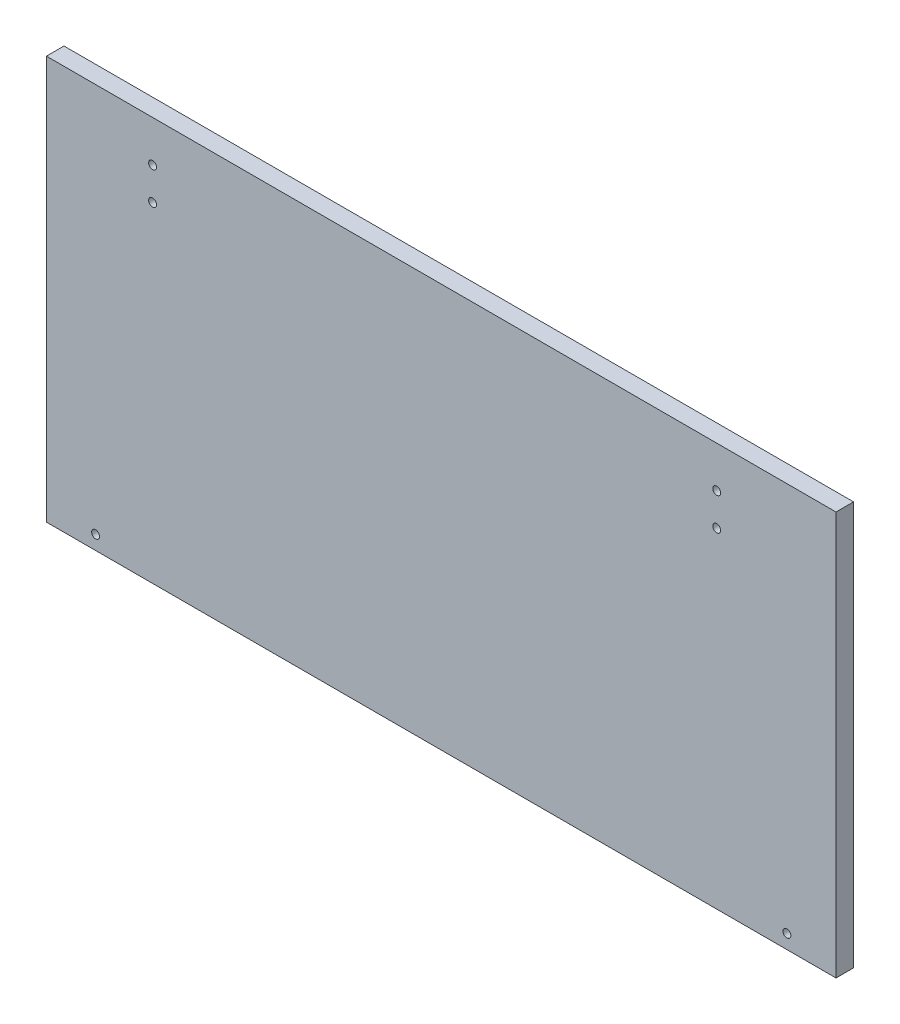
ISO-10303-21;
HEADER;
FILE_DESCRIPTION(('STEP AP214'),'2;1');
FILE_NAME('part.step','',(''),(''),'','','');
FILE_SCHEMA(('AUTOMOTIVE_DESIGN { 1 0 10303 214 1 1 1 1 }'));
ENDSEC;
DATA;
#1=APPLICATION_CONTEXT('core data for automotive mechanical design processes');
#2=APPLICATION_PROTOCOL_DEFINITION('international standard','automotive_design',2000,#1);
#3=PRODUCT_CONTEXT('',#1,'mechanical');
#4=PRODUCT('Part','Part','',(#3));
#5=PRODUCT_RELATED_PRODUCT_CATEGORY('part','',(#4));
#6=PRODUCT_DEFINITION_FORMATION('','',#4);
#7=PRODUCT_DEFINITION_CONTEXT('part definition',#1,'design');
#8=PRODUCT_DEFINITION('design','',#6,#7);
#9=PRODUCT_DEFINITION_SHAPE('','',#8);
#10=(LENGTH_UNIT() NAMED_UNIT(*) SI_UNIT(.MILLI.,.METRE.));
#11=(NAMED_UNIT(*) PLANE_ANGLE_UNIT() SI_UNIT($,.RADIAN.));
#12=(NAMED_UNIT(*) SI_UNIT($,.STERADIAN.) SOLID_ANGLE_UNIT());
#13=UNCERTAINTY_MEASURE_WITH_UNIT(LENGTH_MEASURE(1.E-05),#10,'distance_accuracy_value','');
#14=(GEOMETRIC_REPRESENTATION_CONTEXT(3) GLOBAL_UNCERTAINTY_ASSIGNED_CONTEXT((#13)) GLOBAL_UNIT_ASSIGNED_CONTEXT((#10,
#11,#12)) REPRESENTATION_CONTEXT('',''));
#15=CARTESIAN_POINT('',(0.,0.,0.));
#16=DIRECTION('',(0.,0.,1.));
#17=DIRECTION('',(1.,0.,0.));
#18=AXIS2_PLACEMENT_3D('',#15,#16,#17);
#19=CARTESIAN_POINT('',(-225.,115.,10.));
#20=DIRECTION('',(1.,0.,0.));
#21=DIRECTION('',(0.,1.,0.));
#22=AXIS2_PLACEMENT_3D('',#19,#20,#21);
#23=PLANE('',#22);
#24=DIRECTION('',(0.,-1.,0.));
#25=VECTOR('',#24,1.);
#26=CARTESIAN_POINT('',(-225.,115.,0.));
#27=LINE('',#26,#25);
#28=CARTESIAN_POINT('',(-225.,115.,0.));
#29=VERTEX_POINT('',#28);
#30=CARTESIAN_POINT('',(-225.,-115.,0.));
#31=VERTEX_POINT('',#30);
#32=EDGE_CURVE('E100',#29,#31,#27,.T.);
#33=ORIENTED_EDGE('',*,*,#32,.T.);
#34=DIRECTION('',(0.,0.,-1.));
#35=VECTOR('',#34,1.);
#36=CARTESIAN_POINT('',(-225.,-115.,10.));
#37=LINE('',#36,#35);
#38=CARTESIAN_POINT('',(-225.,-115.,10.));
#39=VERTEX_POINT('',#38);
#40=EDGE_CURVE('E11',#39,#31,#37,.T.);
#41=ORIENTED_EDGE('',*,*,#40,.F.);
#42=DIRECTION('',(0.,-1.,0.));
#43=VECTOR('',#42,1.);
#44=CARTESIAN_POINT('',(-225.,115.,10.));
#45=LINE('',#44,#43);
#46=CARTESIAN_POINT('',(-225.,115.,10.));
#47=VERTEX_POINT('',#46);
#48=EDGE_CURVE('E88',#47,#39,#45,.T.);
#49=ORIENTED_EDGE('',*,*,#48,.F.);
#50=DIRECTION('',(0.,0.,-1.));
#51=VECTOR('',#50,1.);
#52=CARTESIAN_POINT('',(-225.,115.,10.));
#53=LINE('',#52,#51);
#54=EDGE_CURVE('E96',#47,#29,#53,.T.);
#55=ORIENTED_EDGE('',*,*,#54,.T.);
#56=EDGE_LOOP('',(#33,#41,#49,#55));
#57=FACE_BOUND('',#56,.T.);
#58=ADVANCED_FACE('F37',(#57),#23,.F.);
#59=CARTESIAN_POINT('',(-225.,-115.,10.));
#60=DIRECTION('',(0.,1.,0.));
#61=DIRECTION('',(0.,0.,1.));
#62=AXIS2_PLACEMENT_3D('',#59,#60,#61);
#63=PLANE('',#62);
#64=DIRECTION('',(1.,0.,0.));
#65=VECTOR('',#64,1.);
#66=CARTESIAN_POINT('',(-225.,-115.,0.));
#67=LINE('',#66,#65);
#68=CARTESIAN_POINT('',(225.,-115.,0.));
#69=VERTEX_POINT('',#68);
#70=EDGE_CURVE('E92',#31,#69,#67,.T.);
#71=ORIENTED_EDGE('',*,*,#70,.T.);
#72=DIRECTION('',(0.,0.,-1.));
#73=VECTOR('',#72,1.);
#74=CARTESIAN_POINT('',(225.,-115.,10.));
#75=LINE('',#74,#73);
#76=CARTESIAN_POINT('',(225.,-115.,10.));
#77=VERTEX_POINT('',#76);
#78=EDGE_CURVE('E45',#77,#69,#75,.T.);
#79=ORIENTED_EDGE('',*,*,#78,.F.);
#80=DIRECTION('',(1.,0.,0.));
#81=VECTOR('',#80,1.);
#82=CARTESIAN_POINT('',(-225.,-115.,10.));
#83=LINE('',#82,#81);
#84=EDGE_CURVE('E83',#39,#77,#83,.T.);
#85=ORIENTED_EDGE('',*,*,#84,.F.);
#86=ORIENTED_EDGE('',*,*,#40,.T.);
#87=EDGE_LOOP('',(#71,#79,#85,#86));
#88=FACE_BOUND('',#87,.T.);
#89=ADVANCED_FACE('F91',(#88),#63,.F.);
#90=CARTESIAN_POINT('',(225.,115.,10.));
#91=DIRECTION('',(-1.,0.,0.));
#92=DIRECTION('',(0.,-1.,0.));
#93=AXIS2_PLACEMENT_3D('',#90,#91,#92);
#94=PLANE('',#93);
#95=DIRECTION('',(0.,1.,0.));
#96=VECTOR('',#95,1.);
#97=CARTESIAN_POINT('',(225.,115.,0.));
#98=LINE('',#97,#96);
#99=CARTESIAN_POINT('',(225.,115.,0.));
#100=VERTEX_POINT('',#99);
#101=EDGE_CURVE('E70',#69,#100,#98,.T.);
#102=ORIENTED_EDGE('',*,*,#101,.T.);
#103=DIRECTION('',(0.,0.,-1.));
#104=VECTOR('',#103,1.);
#105=CARTESIAN_POINT('',(225.,115.,10.));
#106=LINE('',#105,#104);
#107=CARTESIAN_POINT('',(225.,115.,10.));
#108=VERTEX_POINT('',#107);
#109=EDGE_CURVE('E93',#108,#100,#106,.T.);
#110=ORIENTED_EDGE('',*,*,#109,.F.);
#111=DIRECTION('',(0.,1.,0.));
#112=VECTOR('',#111,1.);
#113=CARTESIAN_POINT('',(225.,115.,10.));
#114=LINE('',#113,#112);
#115=EDGE_CURVE('E86',#77,#108,#114,.T.);
#116=ORIENTED_EDGE('',*,*,#115,.F.);
#117=ORIENTED_EDGE('',*,*,#78,.T.);
#118=EDGE_LOOP('',(#102,#110,#116,#117));
#119=FACE_BOUND('',#118,.T.);
#120=ADVANCED_FACE('F94',(#119),#94,.F.);
#121=CARTESIAN_POINT('',(-225.,115.,10.));
#122=DIRECTION('',(0.,-1.,0.));
#123=DIRECTION('',(0.,0.,-1.));
#124=AXIS2_PLACEMENT_3D('',#121,#122,#123);
#125=PLANE('',#124);
#126=DIRECTION('',(-1.,0.,0.));
#127=VECTOR('',#126,1.);
#128=CARTESIAN_POINT('',(-225.,115.,0.));
#129=LINE('',#128,#127);
#130=EDGE_CURVE('E76',#100,#29,#129,.T.);
#131=ORIENTED_EDGE('',*,*,#130,.T.);
#132=ORIENTED_EDGE('',*,*,#54,.F.);
#133=DIRECTION('',(-1.,0.,0.));
#134=VECTOR('',#133,1.);
#135=CARTESIAN_POINT('',(-225.,115.,10.));
#136=LINE('',#135,#134);
#137=EDGE_CURVE('E53',#108,#47,#136,.T.);
#138=ORIENTED_EDGE('',*,*,#137,.F.);
#139=ORIENTED_EDGE('',*,*,#109,.T.);
#140=EDGE_LOOP('',(#131,#132,#138,#139));
#141=FACE_BOUND('',#140,.T.);
#142=ADVANCED_FACE('F108',(#141),#125,.F.);
#143=CARTESIAN_POINT('',(0.,0.,10.));
#144=DIRECTION('',(0.,0.,1.));
#145=DIRECTION('',(1.,0.,0.));
#146=AXIS2_PLACEMENT_3D('',#143,#144,#145);
#147=PLANE('',#146);
#148=CARTESIAN_POINT('',(-197.,-107.,10.));
#149=DIRECTION('',(0.,0.,1.));
#150=DIRECTION('',(1.,0.,0.));
#151=AXIS2_PLACEMENT_3D('',#148,#149,#150);
#152=CIRCLE('',#151,2.25000000000001);
#153=CARTESIAN_POINT('',(-194.75,-107.,10.));
#154=VERTEX_POINT('',#153);
#155=EDGE_CURVE('E144',#154,#154,#152,.T.);
#156=ORIENTED_EDGE('',*,*,#155,.F.);
#157=EDGE_LOOP('',(#156));
#158=FACE_BOUND('',#157,.T.);
#159=CARTESIAN_POINT('',(197.,-107.,10.));
#160=DIRECTION('',(0.,0.,1.));
#161=DIRECTION('',(1.,0.,0.));
#162=AXIS2_PLACEMENT_3D('',#159,#160,#161);
#163=CIRCLE('',#162,2.25000000000001);
#164=CARTESIAN_POINT('',(199.25,-107.,10.));
#165=VERTEX_POINT('',#164);
#166=EDGE_CURVE('E141',#165,#165,#163,.T.);
#167=ORIENTED_EDGE('',*,*,#166,.F.);
#168=EDGE_LOOP('',(#167));
#169=FACE_BOUND('',#168,.T.);
#170=CARTESIAN_POINT('',(-164.5,72.9999999999998,10.));
#171=DIRECTION('',(0.,0.,1.));
#172=DIRECTION('',(1.,0.,0.));
#173=AXIS2_PLACEMENT_3D('',#170,#171,#172);
#174=CIRCLE('',#173,2.25000000000001);
#175=CARTESIAN_POINT('',(-162.25,72.9999999999998,10.));
#176=VERTEX_POINT('',#175);
#177=EDGE_CURVE('E117',#176,#176,#174,.T.);
#178=ORIENTED_EDGE('',*,*,#177,.F.);
#179=EDGE_LOOP('',(#178));
#180=FACE_BOUND('',#179,.T.);
#181=CARTESIAN_POINT('',(157.,91.4999999999998,10.));
#182=DIRECTION('',(0.,0.,1.));
#183=DIRECTION('',(1.,0.,0.));
#184=AXIS2_PLACEMENT_3D('',#181,#182,#183);
#185=CIRCLE('',#184,2.25000000000001);
#186=CARTESIAN_POINT('',(159.25,91.4999999999998,10.));
#187=VERTEX_POINT('',#186);
#188=EDGE_CURVE('E123',#187,#187,#185,.T.);
#189=ORIENTED_EDGE('',*,*,#188,.F.);
#190=EDGE_LOOP('',(#189));
#191=FACE_BOUND('',#190,.T.);
#192=CARTESIAN_POINT('',(157.,72.9999999999998,10.));
#193=DIRECTION('',(0.,0.,1.));
#194=DIRECTION('',(1.,0.,0.));
#195=AXIS2_PLACEMENT_3D('',#192,#193,#194);
#196=CIRCLE('',#195,2.25000000000001);
#197=CARTESIAN_POINT('',(159.25,72.9999999999998,10.));
#198=VERTEX_POINT('',#197);
#199=EDGE_CURVE('E124',#198,#198,#196,.T.);
#200=ORIENTED_EDGE('',*,*,#199,.F.);
#201=EDGE_LOOP('',(#200));
#202=FACE_BOUND('',#201,.T.);
#203=CARTESIAN_POINT('',(-164.5,91.4999999999998,10.));
#204=DIRECTION('',(0.,0.,1.));
#205=DIRECTION('',(1.,0.,0.));
#206=AXIS2_PLACEMENT_3D('',#203,#204,#205);
#207=CIRCLE('',#206,2.25000000000001);
#208=CARTESIAN_POINT('',(-162.25,91.4999999999998,10.));
#209=VERTEX_POINT('',#208);
#210=EDGE_CURVE('E114',#209,#209,#207,.T.);
#211=ORIENTED_EDGE('',*,*,#210,.F.);
#212=EDGE_LOOP('',(#211));
#213=FACE_BOUND('',#212,.T.);
#214=ORIENTED_EDGE('',*,*,#48,.T.);
#215=ORIENTED_EDGE('',*,*,#84,.T.);
#216=ORIENTED_EDGE('',*,*,#115,.T.);
#217=ORIENTED_EDGE('',*,*,#137,.T.);
#218=EDGE_LOOP('',(#214,#215,#216,#217));
#219=FACE_BOUND('',#218,.T.);
#220=ADVANCED_FACE('F84',(#158,#169,#180,#191,#202,#213,#219),#147,.T.);
#221=CARTESIAN_POINT('',(0.,0.,0.));
#222=DIRECTION('',(0.,0.,1.));
#223=DIRECTION('',(1.,0.,0.));
#224=AXIS2_PLACEMENT_3D('',#221,#222,#223);
#225=PLANE('',#224);
#226=CARTESIAN_POINT('',(-197.,-107.,0.));
#227=DIRECTION('',(0.,0.,1.));
#228=DIRECTION('',(1.,0.,0.));
#229=AXIS2_PLACEMENT_3D('',#226,#227,#228);
#230=CIRCLE('',#229,2.25000000000001);
#231=CARTESIAN_POINT('',(-194.75,-107.,0.));
#232=VERTEX_POINT('',#231);
#233=EDGE_CURVE('E135',#232,#232,#230,.T.);
#234=ORIENTED_EDGE('',*,*,#233,.T.);
#235=EDGE_LOOP('',(#234));
#236=FACE_BOUND('',#235,.T.);
#237=CARTESIAN_POINT('',(197.,-107.,0.));
#238=DIRECTION('',(0.,0.,1.));
#239=DIRECTION('',(1.,0.,0.));
#240=AXIS2_PLACEMENT_3D('',#237,#238,#239);
#241=CIRCLE('',#240,2.25000000000001);
#242=CARTESIAN_POINT('',(199.25,-107.,0.));
#243=VERTEX_POINT('',#242);
#244=EDGE_CURVE('E138',#243,#243,#241,.T.);
#245=ORIENTED_EDGE('',*,*,#244,.T.);
#246=EDGE_LOOP('',(#245));
#247=FACE_BOUND('',#246,.T.);
#248=CARTESIAN_POINT('',(-164.5,72.9999999999998,0.));
#249=DIRECTION('',(0.,0.,1.));
#250=DIRECTION('',(1.,0.,0.));
#251=AXIS2_PLACEMENT_3D('',#248,#249,#250);
#252=CIRCLE('',#251,2.25000000000001);
#253=CARTESIAN_POINT('',(-162.25,72.9999999999998,0.));
#254=VERTEX_POINT('',#253);
#255=EDGE_CURVE('E127',#254,#254,#252,.T.);
#256=ORIENTED_EDGE('',*,*,#255,.T.);
#257=EDGE_LOOP('',(#256));
#258=FACE_BOUND('',#257,.T.);
#259=CARTESIAN_POINT('',(157.,91.4999999999998,0.));
#260=DIRECTION('',(0.,0.,1.));
#261=DIRECTION('',(1.,0.,0.));
#262=AXIS2_PLACEMENT_3D('',#259,#260,#261);
#263=CIRCLE('',#262,2.25000000000001);
#264=CARTESIAN_POINT('',(159.25,91.4999999999998,0.));
#265=VERTEX_POINT('',#264);
#266=EDGE_CURVE('E120',#265,#265,#263,.T.);
#267=ORIENTED_EDGE('',*,*,#266,.T.);
#268=EDGE_LOOP('',(#267));
#269=FACE_BOUND('',#268,.T.);
#270=CARTESIAN_POINT('',(157.,72.9999999999998,0.));
#271=DIRECTION('',(0.,0.,1.));
#272=DIRECTION('',(1.,0.,0.));
#273=AXIS2_PLACEMENT_3D('',#270,#271,#272);
#274=CIRCLE('',#273,2.25000000000001);
#275=CARTESIAN_POINT('',(159.25,72.9999999999998,0.));
#276=VERTEX_POINT('',#275);
#277=EDGE_CURVE('E132',#276,#276,#274,.T.);
#278=ORIENTED_EDGE('',*,*,#277,.T.);
#279=EDGE_LOOP('',(#278));
#280=FACE_BOUND('',#279,.T.);
#281=CARTESIAN_POINT('',(-164.5,91.4999999999998,0.));
#282=DIRECTION('',(0.,0.,1.));
#283=DIRECTION('',(1.,0.,0.));
#284=AXIS2_PLACEMENT_3D('',#281,#282,#283);
#285=CIRCLE('',#284,2.25000000000001);
#286=CARTESIAN_POINT('',(-162.25,91.4999999999998,0.));
#287=VERTEX_POINT('',#286);
#288=EDGE_CURVE('E103',#287,#287,#285,.T.);
#289=ORIENTED_EDGE('',*,*,#288,.T.);
#290=EDGE_LOOP('',(#289));
#291=FACE_BOUND('',#290,.T.);
#292=ORIENTED_EDGE('',*,*,#32,.F.);
#293=ORIENTED_EDGE('',*,*,#130,.F.);
#294=ORIENTED_EDGE('',*,*,#101,.F.);
#295=ORIENTED_EDGE('',*,*,#70,.F.);
#296=EDGE_LOOP('',(#292,#293,#294,#295));
#297=FACE_BOUND('',#296,.T.);
#298=ADVANCED_FACE('F111',(#236,#247,#258,#269,#280,#291,#297),#225,.F.);
#299=CARTESIAN_POINT('',(-164.5,91.4999999999998,0.));
#300=DIRECTION('',(0.,0.,1.));
#301=DIRECTION('',(1.,0.,0.));
#302=AXIS2_PLACEMENT_3D('',#299,#300,#301);
#303=CYLINDRICAL_SURFACE('',#302,2.25000000000001);
#304=ORIENTED_EDGE('',*,*,#288,.F.);
#305=EDGE_LOOP('',(#304));
#306=FACE_BOUND('',#305,.T.);
#307=ORIENTED_EDGE('',*,*,#210,.T.);
#308=EDGE_LOOP('',(#307));
#309=FACE_BOUND('',#308,.T.);
#310=ADVANCED_FACE('F172',(#306,#309),#303,.F.);
#311=CARTESIAN_POINT('',(157.,72.9999999999998,0.));
#312=DIRECTION('',(0.,0.,1.));
#313=DIRECTION('',(1.,0.,0.));
#314=AXIS2_PLACEMENT_3D('',#311,#312,#313);
#315=CYLINDRICAL_SURFACE('',#314,2.25000000000001);
#316=ORIENTED_EDGE('',*,*,#277,.F.);
#317=EDGE_LOOP('',(#316));
#318=FACE_BOUND('',#317,.T.);
#319=ORIENTED_EDGE('',*,*,#199,.T.);
#320=EDGE_LOOP('',(#319));
#321=FACE_BOUND('',#320,.T.);
#322=ADVANCED_FACE('F174',(#318,#321),#315,.F.);
#323=CARTESIAN_POINT('',(157.,91.4999999999998,0.));
#324=DIRECTION('',(0.,0.,1.));
#325=DIRECTION('',(1.,0.,0.));
#326=AXIS2_PLACEMENT_3D('',#323,#324,#325);
#327=CYLINDRICAL_SURFACE('',#326,2.25000000000001);
#328=ORIENTED_EDGE('',*,*,#266,.F.);
#329=EDGE_LOOP('',(#328));
#330=FACE_BOUND('',#329,.T.);
#331=ORIENTED_EDGE('',*,*,#188,.T.);
#332=EDGE_LOOP('',(#331));
#333=FACE_BOUND('',#332,.T.);
#334=ADVANCED_FACE('F181',(#330,#333),#327,.F.);
#335=CARTESIAN_POINT('',(-164.5,72.9999999999998,0.));
#336=DIRECTION('',(0.,0.,1.));
#337=DIRECTION('',(1.,0.,0.));
#338=AXIS2_PLACEMENT_3D('',#335,#336,#337);
#339=CYLINDRICAL_SURFACE('',#338,2.25000000000001);
#340=ORIENTED_EDGE('',*,*,#255,.F.);
#341=EDGE_LOOP('',(#340));
#342=FACE_BOUND('',#341,.T.);
#343=ORIENTED_EDGE('',*,*,#177,.T.);
#344=EDGE_LOOP('',(#343));
#345=FACE_BOUND('',#344,.T.);
#346=ADVANCED_FACE('F221',(#342,#345),#339,.F.);
#347=CARTESIAN_POINT('',(197.,-107.,0.));
#348=DIRECTION('',(0.,0.,1.));
#349=DIRECTION('',(1.,0.,0.));
#350=AXIS2_PLACEMENT_3D('',#347,#348,#349);
#351=CYLINDRICAL_SURFACE('',#350,2.25000000000001);
#352=ORIENTED_EDGE('',*,*,#244,.F.);
#353=EDGE_LOOP('',(#352));
#354=FACE_BOUND('',#353,.T.);
#355=ORIENTED_EDGE('',*,*,#166,.T.);
#356=EDGE_LOOP('',(#355));
#357=FACE_BOUND('',#356,.T.);
#358=ADVANCED_FACE('F155',(#354,#357),#351,.F.);
#359=CARTESIAN_POINT('',(-197.,-107.,0.));
#360=DIRECTION('',(0.,0.,1.));
#361=DIRECTION('',(1.,0.,0.));
#362=AXIS2_PLACEMENT_3D('',#359,#360,#361);
#363=CYLINDRICAL_SURFACE('',#362,2.25000000000001);
#364=ORIENTED_EDGE('',*,*,#233,.F.);
#365=EDGE_LOOP('',(#364));
#366=FACE_BOUND('',#365,.T.);
#367=ORIENTED_EDGE('',*,*,#155,.T.);
#368=EDGE_LOOP('',(#367));
#369=FACE_BOUND('',#368,.T.);
#370=ADVANCED_FACE('F152',(#366,#369),#363,.F.);
#371=CLOSED_SHELL('',(#58,#89,#120,#142,#220,#298,#310,#322,#334,#346,#358,#370));
#372=MANIFOLD_SOLID_BREP('B2',#371);
#373=ADVANCED_BREP_SHAPE_REPRESENTATION('',(#18,#372),#14);
#374=SHAPE_DEFINITION_REPRESENTATION(#9,#373);
ENDSEC;
END-ISO-10303-21;
